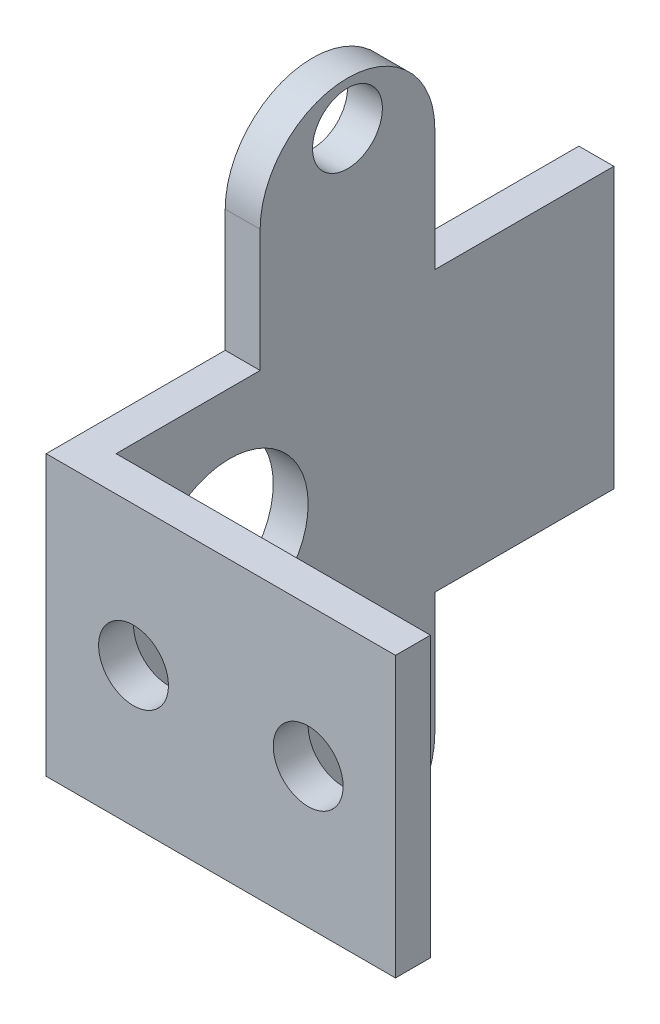
ISO-10303-21;
HEADER;
FILE_DESCRIPTION(('STEP AP214'),'2;1');
FILE_NAME('part.step','',(''),(''),'','','');
FILE_SCHEMA(('AUTOMOTIVE_DESIGN { 1 0 10303 214 1 1 1 1 }'));
ENDSEC;
DATA;
#1=APPLICATION_CONTEXT('core data for automotive mechanical design processes');
#2=APPLICATION_PROTOCOL_DEFINITION('international standard','automotive_design',2000,#1);
#3=PRODUCT_CONTEXT('',#1,'mechanical');
#4=PRODUCT('Part','Part','',(#3));
#5=PRODUCT_RELATED_PRODUCT_CATEGORY('part','',(#4));
#6=PRODUCT_DEFINITION_FORMATION('','',#4);
#7=PRODUCT_DEFINITION_CONTEXT('part definition',#1,'design');
#8=PRODUCT_DEFINITION('design','',#6,#7);
#9=PRODUCT_DEFINITION_SHAPE('','',#8);
#10=(LENGTH_UNIT() NAMED_UNIT(*) SI_UNIT(.MILLI.,.METRE.));
#11=(NAMED_UNIT(*) PLANE_ANGLE_UNIT() SI_UNIT($,.RADIAN.));
#12=(NAMED_UNIT(*) SI_UNIT($,.STERADIAN.) SOLID_ANGLE_UNIT());
#13=UNCERTAINTY_MEASURE_WITH_UNIT(LENGTH_MEASURE(1.E-05),#10,'distance_accuracy_value','');
#14=(GEOMETRIC_REPRESENTATION_CONTEXT(3) GLOBAL_UNCERTAINTY_ASSIGNED_CONTEXT((#13)) GLOBAL_UNIT_ASSIGNED_CONTEXT((#10,
#11,#12)) REPRESENTATION_CONTEXT('',''));
#15=CARTESIAN_POINT('',(0.,0.,0.));
#16=DIRECTION('',(0.,0.,1.));
#17=DIRECTION('',(1.,0.,0.));
#18=AXIS2_PLACEMENT_3D('',#15,#16,#17);
#19=CARTESIAN_POINT('',(-17.9226804123711,16.,-12.5249140893471));
#20=DIRECTION('',(1.,0.,0.));
#21=DIRECTION('',(0.,0.,-1.));
#22=AXIS2_PLACEMENT_3D('',#19,#20,#21);
#23=PLANE('',#22);
#24=CARTESIAN_POINT('',(-17.9226804123711,8.,9.47508591065292));
#25=DIRECTION('',(1.,0.,0.));
#26=DIRECTION('',(0.,0.,-1.));
#27=AXIS2_PLACEMENT_3D('',#24,#25,#26);
#28=CIRCLE('',#27,4.5);
#29=CARTESIAN_POINT('',(-17.9226804123711,8.,4.97508591065292));
#30=VERTEX_POINT('',#29);
#31=EDGE_CURVE('E339',#30,#30,#28,.T.);
#32=ORIENTED_EDGE('',*,*,#31,.T.);
#33=EDGE_LOOP('',(#32));
#34=FACE_BOUND('',#33,.T.);
#35=CARTESIAN_POINT('',(-17.9226804123711,25.5,2.72508591065292));
#36=DIRECTION('',(1.,0.,0.));
#37=DIRECTION('',(0.,0.,-1.));
#38=AXIS2_PLACEMENT_3D('',#35,#36,#37);
#39=CIRCLE('',#38,2.);
#40=CARTESIAN_POINT('',(-17.9226804123711,25.5,0.725085910652916));
#41=VERTEX_POINT('',#40);
#42=EDGE_CURVE('E154',#41,#41,#39,.F.);
#43=ORIENTED_EDGE('',*,*,#42,.F.);
#44=EDGE_LOOP('',(#43));
#45=FACE_BOUND('',#44,.T.);
#46=CARTESIAN_POINT('',(-17.9226804123711,-9.5,2.72508591065292));
#47=DIRECTION('',(1.,0.,0.));
#48=DIRECTION('',(0.,0.,-1.));
#49=AXIS2_PLACEMENT_3D('',#46,#47,#48);
#50=CIRCLE('',#49,2.);
#51=CARTESIAN_POINT('',(-17.9226804123711,-9.5,0.725085910652916));
#52=VERTEX_POINT('',#51);
#53=EDGE_CURVE('E173',#52,#52,#50,.T.);
#54=ORIENTED_EDGE('',*,*,#53,.T.);
#55=EDGE_LOOP('',(#54));
#56=FACE_BOUND('',#55,.T.);
#57=CARTESIAN_POINT('',(-17.9226804123711,23.,2.72508591065292));
#58=DIRECTION('',(1.,0.,0.));
#59=DIRECTION('',(0.,0.,-1.));
#60=AXIS2_PLACEMENT_3D('',#57,#58,#59);
#61=CIRCLE('',#60,5.);
#62=CARTESIAN_POINT('',(-17.9226804123711,23.,-2.27491408934708));
#63=VERTEX_POINT('',#62);
#64=CARTESIAN_POINT('',(-17.9226804123711,23.,7.72508591065292));
#65=VERTEX_POINT('',#64);
#66=EDGE_CURVE('E158',#63,#65,#61,.T.);
#67=ORIENTED_EDGE('',*,*,#66,.F.);
#68=DIRECTION('',(0.,-1.,0.));
#69=VECTOR('',#68,1.);
#70=CARTESIAN_POINT('',(-17.9226804123711,28.,-2.27491408934708));
#71=LINE('',#70,#69);
#72=CARTESIAN_POINT('',(-17.9226804123711,16.,-2.27491408934708));
#73=VERTEX_POINT('',#72);
#74=EDGE_CURVE('E167',#63,#73,#71,.T.);
#75=ORIENTED_EDGE('',*,*,#74,.T.);
#76=DIRECTION('',(0.,0.,1.));
#77=VECTOR('',#76,1.);
#78=CARTESIAN_POINT('',(-17.9226804123711,16.,-12.5249140893471));
#79=LINE('',#78,#77);
#80=CARTESIAN_POINT('',(-17.9226804123711,16.,-12.5249140893471));
#81=VERTEX_POINT('',#80);
#82=EDGE_CURVE('E211',#81,#73,#79,.T.);
#83=ORIENTED_EDGE('',*,*,#82,.F.);
#84=DIRECTION('',(0.,-1.,0.));
#85=VECTOR('',#84,1.);
#86=CARTESIAN_POINT('',(-17.9226804123711,16.,-12.5249140893471));
#87=LINE('',#86,#85);
#88=CARTESIAN_POINT('',(-17.9226804123711,0.,-12.5249140893471));
#89=VERTEX_POINT('',#88);
#90=EDGE_CURVE('E11',#81,#89,#87,.T.);
#91=ORIENTED_EDGE('',*,*,#90,.T.);
#92=DIRECTION('',(0.,0.,1.));
#93=VECTOR('',#92,1.);
#94=CARTESIAN_POINT('',(-17.9226804123711,0.,-12.5249140893471));
#95=LINE('',#94,#93);
#96=CARTESIAN_POINT('',(-17.9226804123711,0.,-2.27491408934708));
#97=VERTEX_POINT('',#96);
#98=EDGE_CURVE('E228',#89,#97,#95,.T.);
#99=ORIENTED_EDGE('',*,*,#98,.T.);
#100=DIRECTION('',(0.,1.,0.));
#101=VECTOR('',#100,1.);
#102=CARTESIAN_POINT('',(-17.9226804123711,-12.,-2.27491408934708));
#103=LINE('',#102,#101);
#104=CARTESIAN_POINT('',(-17.9226804123711,-7.,-2.27491408934708));
#105=VERTEX_POINT('',#104);
#106=EDGE_CURVE('E197',#105,#97,#103,.T.);
#107=ORIENTED_EDGE('',*,*,#106,.F.);
#108=CARTESIAN_POINT('',(-17.9226804123711,-7.,2.72508591065292));
#109=DIRECTION('',(1.,0.,0.));
#110=DIRECTION('',(0.,0.,-1.));
#111=AXIS2_PLACEMENT_3D('',#108,#109,#110);
#112=CIRCLE('',#111,5.);
#113=CARTESIAN_POINT('',(-17.9226804123711,-7.,7.72508591065292));
#114=VERTEX_POINT('',#113);
#115=EDGE_CURVE('E182',#105,#114,#112,.F.);
#116=ORIENTED_EDGE('',*,*,#115,.T.);
#117=DIRECTION('',(0.,1.,0.));
#118=VECTOR('',#117,1.);
#119=CARTESIAN_POINT('',(-17.9226804123711,-12.,7.72508591065292));
#120=LINE('',#119,#118);
#121=CARTESIAN_POINT('',(-17.9226804123711,0.,7.72508591065291));
#122=VERTEX_POINT('',#121);
#123=EDGE_CURVE('E191',#114,#122,#120,.T.);
#124=ORIENTED_EDGE('',*,*,#123,.T.);
#125=CARTESIAN_POINT('',(-17.9226804123711,0.,17.9750859106529));
#126=VERTEX_POINT('',#125);
#127=EDGE_CURVE('E227',#122,#126,#95,.T.);
#128=ORIENTED_EDGE('',*,*,#127,.T.);
#129=DIRECTION('',(0.,-1.,0.));
#130=VECTOR('',#129,1.);
#131=CARTESIAN_POINT('',(-17.9226804123711,16.,17.9750859106529));
#132=LINE('',#131,#130);
#133=CARTESIAN_POINT('',(-17.9226804123711,16.,17.9750859106529));
#134=VERTEX_POINT('',#133);
#135=EDGE_CURVE('E52',#134,#126,#132,.T.);
#136=ORIENTED_EDGE('',*,*,#135,.F.);
#137=CARTESIAN_POINT('',(-17.9226804123711,16.,7.72508591065291));
#138=VERTEX_POINT('',#137);
#139=EDGE_CURVE('E209',#138,#134,#79,.T.);
#140=ORIENTED_EDGE('',*,*,#139,.F.);
#141=DIRECTION('',(0.,-1.,0.));
#142=VECTOR('',#141,1.);
#143=CARTESIAN_POINT('',(-17.9226804123711,28.,7.72508591065292));
#144=LINE('',#143,#142);
#145=EDGE_CURVE('E68',#65,#138,#144,.T.);
#146=ORIENTED_EDGE('',*,*,#145,.F.);
#147=EDGE_LOOP('',(#67,#75,#83,#91,#99,#107,#116,#124,#128,#136,#140,#146));
#148=FACE_BOUND('',#147,.T.);
#149=ADVANCED_FACE('F43',(#34,#45,#56,#148),#23,.F.);
#150=CARTESIAN_POINT('',(-15.9226804123711,16.,-12.5249140893471));
#151=DIRECTION('',(-1.,0.,0.));
#152=DIRECTION('',(0.,0.,1.));
#153=AXIS2_PLACEMENT_3D('',#150,#151,#152);
#154=PLANE('',#153);
#155=CARTESIAN_POINT('',(-15.9226804123711,8.,9.47508591065292));
#156=DIRECTION('',(1.,0.,0.));
#157=DIRECTION('',(0.,0.,-1.));
#158=AXIS2_PLACEMENT_3D('',#155,#156,#157);
#159=CIRCLE('',#158,4.5);
#160=CARTESIAN_POINT('',(-15.9226804123711,8.,4.97508591065292));
#161=VERTEX_POINT('',#160);
#162=EDGE_CURVE('E341',#161,#161,#159,.T.);
#163=ORIENTED_EDGE('',*,*,#162,.F.);
#164=EDGE_LOOP('',(#163));
#165=FACE_BOUND('',#164,.T.);
#166=CARTESIAN_POINT('',(-15.9226804123711,25.5,2.72508591065292));
#167=DIRECTION('',(-1.,0.,0.));
#168=DIRECTION('',(0.,0.,-1.));
#169=AXIS2_PLACEMENT_3D('',#166,#167,#168);
#170=CIRCLE('',#169,2.);
#171=CARTESIAN_POINT('',(-15.9226804123711,25.5,0.725085910652916));
#172=VERTEX_POINT('',#171);
#173=EDGE_CURVE('E336',#172,#172,#170,.T.);
#174=ORIENTED_EDGE('',*,*,#173,.T.);
#175=EDGE_LOOP('',(#174));
#176=FACE_BOUND('',#175,.T.);
#177=CARTESIAN_POINT('',(-15.9226804123711,-9.5,2.72508591065292));
#178=DIRECTION('',(1.,0.,0.));
#179=DIRECTION('',(0.,0.,-1.));
#180=AXIS2_PLACEMENT_3D('',#177,#178,#179);
#181=CIRCLE('',#180,2.);
#182=CARTESIAN_POINT('',(-15.9226804123711,-9.5,0.725085910652916));
#183=VERTEX_POINT('',#182);
#184=EDGE_CURVE('E165',#183,#183,#181,.T.);
#185=ORIENTED_EDGE('',*,*,#184,.F.);
#186=EDGE_LOOP('',(#185));
#187=FACE_BOUND('',#186,.T.);
#188=CARTESIAN_POINT('',(-15.9226804123711,23.,2.72508591065292));
#189=DIRECTION('',(1.,0.,0.));
#190=DIRECTION('',(0.,0.,-1.));
#191=AXIS2_PLACEMENT_3D('',#188,#189,#190);
#192=CIRCLE('',#191,5.);
#193=CARTESIAN_POINT('',(-15.9226804123711,23.,-2.27491408934708));
#194=VERTEX_POINT('',#193);
#195=CARTESIAN_POINT('',(-15.9226804123711,23.,7.72508591065292));
#196=VERTEX_POINT('',#195);
#197=EDGE_CURVE('E60',#194,#196,#192,.T.);
#198=ORIENTED_EDGE('',*,*,#197,.T.);
#199=DIRECTION('',(0.,-1.,0.));
#200=VECTOR('',#199,1.);
#201=CARTESIAN_POINT('',(-15.9226804123711,28.,7.72508591065292));
#202=LINE('',#201,#200);
#203=CARTESIAN_POINT('',(-15.9226804123711,16.,7.72508591065292));
#204=VERTEX_POINT('',#203);
#205=EDGE_CURVE('E150',#196,#204,#202,.T.);
#206=ORIENTED_EDGE('',*,*,#205,.T.);
#207=DIRECTION('',(0.,0.,-1.));
#208=VECTOR('',#207,1.);
#209=CARTESIAN_POINT('',(-15.9226804123711,16.,-12.5249140893471));
#210=LINE('',#209,#208);
#211=CARTESIAN_POINT('',(-15.9226804123711,16.,15.9750859106529));
#212=VERTEX_POINT('',#211);
#213=EDGE_CURVE('E221',#212,#204,#210,.T.);
#214=ORIENTED_EDGE('',*,*,#213,.F.);
#215=DIRECTION('',(0.,-1.,0.));
#216=VECTOR('',#215,1.);
#217=CARTESIAN_POINT('',(-15.9226804123711,16.,15.9750859106529));
#218=LINE('',#217,#216);
#219=CARTESIAN_POINT('',(-15.9226804123711,0.,15.9750859106529));
#220=VERTEX_POINT('',#219);
#221=EDGE_CURVE('E242',#212,#220,#218,.T.);
#222=ORIENTED_EDGE('',*,*,#221,.T.);
#223=DIRECTION('',(0.,0.,-1.));
#224=VECTOR('',#223,1.);
#225=CARTESIAN_POINT('',(-15.9226804123711,0.,-12.5249140893471));
#226=LINE('',#225,#224);
#227=CARTESIAN_POINT('',(-15.9226804123711,0.,7.72508591065292));
#228=VERTEX_POINT('',#227);
#229=EDGE_CURVE('E210',#220,#228,#226,.T.);
#230=ORIENTED_EDGE('',*,*,#229,.T.);
#231=DIRECTION('',(0.,1.,0.));
#232=VECTOR('',#231,1.);
#233=CARTESIAN_POINT('',(-15.9226804123711,-12.,7.72508591065292));
#234=LINE('',#233,#232);
#235=CARTESIAN_POINT('',(-15.9226804123711,-7.,7.72508591065292));
#236=VERTEX_POINT('',#235);
#237=EDGE_CURVE('E193',#236,#228,#234,.T.);
#238=ORIENTED_EDGE('',*,*,#237,.F.);
#239=CARTESIAN_POINT('',(-15.9226804123711,-7.,2.72508591065292));
#240=DIRECTION('',(-1.,0.,0.));
#241=DIRECTION('',(0.,0.,-1.));
#242=AXIS2_PLACEMENT_3D('',#239,#240,#241);
#243=CIRCLE('',#242,5.);
#244=CARTESIAN_POINT('',(-15.9226804123711,-7.,-2.27491408934708));
#245=VERTEX_POINT('',#244);
#246=EDGE_CURVE('E176',#245,#236,#243,.T.);
#247=ORIENTED_EDGE('',*,*,#246,.F.);
#248=DIRECTION('',(0.,1.,0.));
#249=VECTOR('',#248,1.);
#250=CARTESIAN_POINT('',(-15.9226804123711,-12.,-2.27491408934708));
#251=LINE('',#250,#249);
#252=CARTESIAN_POINT('',(-15.9226804123711,0.,-2.27491408934708));
#253=VERTEX_POINT('',#252);
#254=EDGE_CURVE('E195',#245,#253,#251,.T.);
#255=ORIENTED_EDGE('',*,*,#254,.T.);
#256=CARTESIAN_POINT('',(-15.9226804123711,0.,-12.5249140893471));
#257=VERTEX_POINT('',#256);
#258=EDGE_CURVE('E237',#253,#257,#226,.T.);
#259=ORIENTED_EDGE('',*,*,#258,.T.);
#260=DIRECTION('',(0.,-1.,0.));
#261=VECTOR('',#260,1.);
#262=CARTESIAN_POINT('',(-15.9226804123711,16.,-12.5249140893471));
#263=LINE('',#262,#261);
#264=CARTESIAN_POINT('',(-15.9226804123711,16.,-12.5249140893471));
#265=VERTEX_POINT('',#264);
#266=EDGE_CURVE('E223',#265,#257,#263,.T.);
#267=ORIENTED_EDGE('',*,*,#266,.F.);
#268=CARTESIAN_POINT('',(-15.9226804123711,16.,-2.27491408934708));
#269=VERTEX_POINT('',#268);
#270=EDGE_CURVE('E220',#269,#265,#210,.T.);
#271=ORIENTED_EDGE('',*,*,#270,.F.);
#272=DIRECTION('',(0.,-1.,0.));
#273=VECTOR('',#272,1.);
#274=CARTESIAN_POINT('',(-15.9226804123711,28.,-2.27491408934708));
#275=LINE('',#274,#273);
#276=EDGE_CURVE('E152',#194,#269,#275,.T.);
#277=ORIENTED_EDGE('',*,*,#276,.F.);
#278=EDGE_LOOP('',(#198,#206,#214,#222,#230,#238,#247,#255,#259,#267,#271,#277));
#279=FACE_BOUND('',#278,.T.);
#280=ADVANCED_FACE('F147',(#165,#176,#187,#279),#154,.F.);
#281=CARTESIAN_POINT('',(-17.9226804123711,28.,-2.27491408934708));
#282=DIRECTION('',(0.,0.,-1.));
#283=DIRECTION('',(-1.,0.,0.));
#284=AXIS2_PLACEMENT_3D('',#281,#282,#283);
#285=PLANE('',#284);
#286=ORIENTED_EDGE('',*,*,#74,.F.);
#287=DIRECTION('',(1.,0.,0.));
#288=VECTOR('',#287,1.);
#289=CARTESIAN_POINT('',(-27.9226804123711,23.,-2.27491408934708));
#290=LINE('',#289,#288);
#291=EDGE_CURVE('E159',#63,#194,#290,.T.);
#292=ORIENTED_EDGE('',*,*,#291,.T.);
#293=ORIENTED_EDGE('',*,*,#276,.T.);
#294=DIRECTION('',(1.,0.,0.));
#295=VECTOR('',#294,1.);
#296=CARTESIAN_POINT('',(-17.9226804123711,16.,-2.27491408934708));
#297=LINE('',#296,#295);
#298=EDGE_CURVE('E324',#73,#269,#297,.T.);
#299=ORIENTED_EDGE('',*,*,#298,.F.);
#300=EDGE_LOOP('',(#286,#292,#293,#299));
#301=FACE_BOUND('',#300,.T.);
#302=ADVANCED_FACE('F283',(#301),#285,.T.);
#303=CARTESIAN_POINT('',(0.,16.,0.));
#304=DIRECTION('',(0.,-1.,0.));
#305=DIRECTION('',(0.,0.,-1.));
#306=AXIS2_PLACEMENT_3D('',#303,#304,#305);
#307=PLANE('',#306);
#308=ORIENTED_EDGE('',*,*,#82,.T.);
#309=ORIENTED_EDGE('',*,*,#298,.T.);
#310=ORIENTED_EDGE('',*,*,#270,.T.);
#311=DIRECTION('',(-1.,0.,0.));
#312=VECTOR('',#311,1.);
#313=CARTESIAN_POINT('',(-17.9226804123711,16.,-12.5249140893471));
#314=LINE('',#313,#312);
#315=EDGE_CURVE('E206',#265,#81,#314,.T.);
#316=ORIENTED_EDGE('',*,*,#315,.T.);
#317=EDGE_LOOP('',(#308,#309,#310,#316));
#318=FACE_BOUND('',#317,.T.);
#319=ADVANCED_FACE('F306',(#318),#307,.F.);
#320=CARTESIAN_POINT('',(-17.9226804123711,-12.,7.72508591065292));
#321=DIRECTION('',(0.,0.,-1.));
#322=DIRECTION('',(-1.,0.,0.));
#323=AXIS2_PLACEMENT_3D('',#320,#321,#322);
#324=PLANE('',#323);
#325=DIRECTION('',(1.,0.,0.));
#326=VECTOR('',#325,1.);
#327=CARTESIAN_POINT('',(-27.9226804123711,-7.,7.72508591065292));
#328=LINE('',#327,#326);
#329=EDGE_CURVE('E179',#114,#236,#328,.T.);
#330=ORIENTED_EDGE('',*,*,#329,.T.);
#331=ORIENTED_EDGE('',*,*,#237,.T.);
#332=DIRECTION('',(-1.,0.,0.));
#333=VECTOR('',#332,1.);
#334=CARTESIAN_POINT('',(-17.9226804123711,0.,7.72508591065292));
#335=LINE('',#334,#333);
#336=EDGE_CURVE('E188',#228,#122,#335,.T.);
#337=ORIENTED_EDGE('',*,*,#336,.T.);
#338=ORIENTED_EDGE('',*,*,#123,.F.);
#339=EDGE_LOOP('',(#330,#331,#337,#338));
#340=FACE_BOUND('',#339,.T.);
#341=ADVANCED_FACE('F311',(#340),#324,.F.);
#342=CARTESIAN_POINT('',(0.,0.,0.));
#343=DIRECTION('',(0.,-1.,0.));
#344=DIRECTION('',(0.,0.,-1.));
#345=AXIS2_PLACEMENT_3D('',#342,#343,#344);
#346=PLANE('',#345);
#347=ORIENTED_EDGE('',*,*,#336,.F.);
#348=ORIENTED_EDGE('',*,*,#229,.F.);
#349=DIRECTION('',(-1.,0.,0.));
#350=VECTOR('',#349,1.);
#351=CARTESIAN_POINT('',(-15.9226804123711,0.,15.9750859106529));
#352=LINE('',#351,#350);
#353=CARTESIAN_POINT('',(2.07731958762886,0.,15.9750859106529));
#354=VERTEX_POINT('',#353);
#355=EDGE_CURVE('E235',#354,#220,#352,.T.);
#356=ORIENTED_EDGE('',*,*,#355,.F.);
#357=DIRECTION('',(0.,0.,-1.));
#358=VECTOR('',#357,1.);
#359=CARTESIAN_POINT('',(2.07731958762886,0.,15.9750859106529));
#360=LINE('',#359,#358);
#361=CARTESIAN_POINT('',(2.07731958762886,0.,17.9750859106529));
#362=VERTEX_POINT('',#361);
#363=EDGE_CURVE('E233',#362,#354,#360,.T.);
#364=ORIENTED_EDGE('',*,*,#363,.F.);
#365=DIRECTION('',(1.,0.,0.));
#366=VECTOR('',#365,1.);
#367=CARTESIAN_POINT('',(-17.9226804123711,0.,17.9750859106529));
#368=LINE('',#367,#366);
#369=EDGE_CURVE('E231',#126,#362,#368,.T.);
#370=ORIENTED_EDGE('',*,*,#369,.F.);
#371=ORIENTED_EDGE('',*,*,#127,.F.);
#372=EDGE_LOOP('',(#347,#348,#356,#364,#370,#371));
#373=FACE_BOUND('',#372,.T.);
#374=ADVANCED_FACE('F303',(#373),#346,.T.);
#375=CARTESIAN_POINT('',(-17.9226804123711,16.,-12.5249140893471));
#376=DIRECTION('',(0.,0.,1.));
#377=DIRECTION('',(1.,0.,0.));
#378=AXIS2_PLACEMENT_3D('',#375,#376,#377);
#379=PLANE('',#378);
#380=DIRECTION('',(-1.,0.,0.));
#381=VECTOR('',#380,1.);
#382=CARTESIAN_POINT('',(-17.9226804123711,0.,-12.5249140893471));
#383=LINE('',#382,#381);
#384=EDGE_CURVE('E224',#257,#89,#383,.T.);
#385=ORIENTED_EDGE('',*,*,#384,.T.);
#386=ORIENTED_EDGE('',*,*,#90,.F.);
#387=ORIENTED_EDGE('',*,*,#315,.F.);
#388=ORIENTED_EDGE('',*,*,#266,.T.);
#389=EDGE_LOOP('',(#385,#386,#387,#388));
#390=FACE_BOUND('',#389,.T.);
#391=ADVANCED_FACE('F45',(#390),#379,.F.);
#392=CARTESIAN_POINT('',(-17.9226804123711,16.,17.9750859106529));
#393=DIRECTION('',(0.,0.,-1.));
#394=DIRECTION('',(-1.,0.,0.));
#395=AXIS2_PLACEMENT_3D('',#392,#393,#394);
#396=PLANE('',#395);
#397=CARTESIAN_POINT('',(-12.9226804123711,8.,17.9750859106529));
#398=DIRECTION('',(0.,0.,1.));
#399=DIRECTION('',(1.,0.,0.));
#400=AXIS2_PLACEMENT_3D('',#397,#398,#399);
#401=CIRCLE('',#400,2.);
#402=CARTESIAN_POINT('',(-10.9226804123711,8.,17.9750859106529));
#403=VERTEX_POINT('',#402);
#404=EDGE_CURVE('E200',#403,#403,#401,.T.);
#405=ORIENTED_EDGE('',*,*,#404,.F.);
#406=EDGE_LOOP('',(#405));
#407=FACE_BOUND('',#406,.T.);
#408=CARTESIAN_POINT('',(-2.92268041237114,8.,17.9750859106529));
#409=DIRECTION('',(0.,0.,1.));
#410=DIRECTION('',(1.,0.,0.));
#411=AXIS2_PLACEMENT_3D('',#408,#409,#410);
#412=CIRCLE('',#411,2.);
#413=CARTESIAN_POINT('',(-0.922680412371144,8.,17.9750859106529));
#414=VERTEX_POINT('',#413);
#415=EDGE_CURVE('E199',#414,#414,#412,.T.);
#416=ORIENTED_EDGE('',*,*,#415,.F.);
#417=EDGE_LOOP('',(#416));
#418=FACE_BOUND('',#417,.T.);
#419=ORIENTED_EDGE('',*,*,#369,.T.);
#420=DIRECTION('',(0.,-1.,0.));
#421=VECTOR('',#420,1.);
#422=CARTESIAN_POINT('',(2.07731958762886,16.,17.9750859106529));
#423=LINE('',#422,#421);
#424=CARTESIAN_POINT('',(2.07731958762886,16.,17.9750859106529));
#425=VERTEX_POINT('',#424);
#426=EDGE_CURVE('E248',#425,#362,#423,.T.);
#427=ORIENTED_EDGE('',*,*,#426,.F.);
#428=DIRECTION('',(1.,0.,0.));
#429=VECTOR('',#428,1.);
#430=CARTESIAN_POINT('',(-17.9226804123711,16.,17.9750859106529));
#431=LINE('',#430,#429);
#432=EDGE_CURVE('E214',#134,#425,#431,.T.);
#433=ORIENTED_EDGE('',*,*,#432,.F.);
#434=ORIENTED_EDGE('',*,*,#135,.T.);
#435=EDGE_LOOP('',(#419,#427,#433,#434));
#436=FACE_BOUND('',#435,.T.);
#437=ADVANCED_FACE('F289',(#407,#418,#436),#396,.F.);
#438=CARTESIAN_POINT('',(2.07731958762886,16.,15.9750859106529));
#439=DIRECTION('',(-1.,0.,0.));
#440=DIRECTION('',(0.,0.,1.));
#441=AXIS2_PLACEMENT_3D('',#438,#439,#440);
#442=PLANE('',#441);
#443=ORIENTED_EDGE('',*,*,#363,.T.);
#444=DIRECTION('',(0.,-1.,0.));
#445=VECTOR('',#444,1.);
#446=CARTESIAN_POINT('',(2.07731958762886,16.,15.9750859106529));
#447=LINE('',#446,#445);
#448=CARTESIAN_POINT('',(2.07731958762886,16.,15.9750859106529));
#449=VERTEX_POINT('',#448);
#450=EDGE_CURVE('E245',#449,#354,#447,.T.);
#451=ORIENTED_EDGE('',*,*,#450,.F.);
#452=DIRECTION('',(0.,0.,-1.));
#453=VECTOR('',#452,1.);
#454=CARTESIAN_POINT('',(2.07731958762886,16.,15.9750859106529));
#455=LINE('',#454,#453);
#456=EDGE_CURVE('E216',#425,#449,#455,.T.);
#457=ORIENTED_EDGE('',*,*,#456,.F.);
#458=ORIENTED_EDGE('',*,*,#426,.T.);
#459=EDGE_LOOP('',(#443,#451,#457,#458));
#460=FACE_BOUND('',#459,.T.);
#461=ADVANCED_FACE('F292',(#460),#442,.F.);
#462=CARTESIAN_POINT('',(-15.9226804123711,16.,15.9750859106529));
#463=DIRECTION('',(0.,0.,1.));
#464=DIRECTION('',(1.,0.,0.));
#465=AXIS2_PLACEMENT_3D('',#462,#463,#464);
#466=PLANE('',#465);
#467=CARTESIAN_POINT('',(-12.9226804123711,8.,15.9750859106529));
#468=DIRECTION('',(0.,0.,1.));
#469=DIRECTION('',(1.,0.,0.));
#470=AXIS2_PLACEMENT_3D('',#467,#468,#469);
#471=CIRCLE('',#470,2.);
#472=CARTESIAN_POINT('',(-10.9226804123711,8.,15.9750859106529));
#473=VERTEX_POINT('',#472);
#474=EDGE_CURVE('E47',#473,#473,#471,.T.);
#475=ORIENTED_EDGE('',*,*,#474,.T.);
#476=EDGE_LOOP('',(#475));
#477=FACE_BOUND('',#476,.T.);
#478=CARTESIAN_POINT('',(-2.92268041237114,8.,15.9750859106529));
#479=DIRECTION('',(0.,0.,1.));
#480=DIRECTION('',(1.,0.,0.));
#481=AXIS2_PLACEMENT_3D('',#478,#479,#480);
#482=CIRCLE('',#481,2.);
#483=CARTESIAN_POINT('',(-0.922680412371144,8.,15.9750859106529));
#484=VERTEX_POINT('',#483);
#485=EDGE_CURVE('E203',#484,#484,#482,.T.);
#486=ORIENTED_EDGE('',*,*,#485,.T.);
#487=EDGE_LOOP('',(#486));
#488=FACE_BOUND('',#487,.T.);
#489=ORIENTED_EDGE('',*,*,#355,.T.);
#490=ORIENTED_EDGE('',*,*,#221,.F.);
#491=DIRECTION('',(-1.,0.,0.));
#492=VECTOR('',#491,1.);
#493=CARTESIAN_POINT('',(-15.9226804123711,16.,15.9750859106529));
#494=LINE('',#493,#492);
#495=EDGE_CURVE('E218',#449,#212,#494,.T.);
#496=ORIENTED_EDGE('',*,*,#495,.F.);
#497=ORIENTED_EDGE('',*,*,#450,.T.);
#498=EDGE_LOOP('',(#489,#490,#496,#497));
#499=FACE_BOUND('',#498,.T.);
#500=ADVANCED_FACE('F258',(#477,#488,#499),#466,.F.);
#501=ORIENTED_EDGE('',*,*,#213,.T.);
#502=DIRECTION('',(-1.,0.,0.));
#503=VECTOR('',#502,1.);
#504=CARTESIAN_POINT('',(-17.9226804123711,16.,7.72508591065292));
#505=LINE('',#504,#503);
#506=EDGE_CURVE('E162',#204,#138,#505,.T.);
#507=ORIENTED_EDGE('',*,*,#506,.T.);
#508=ORIENTED_EDGE('',*,*,#139,.T.);
#509=ORIENTED_EDGE('',*,*,#432,.T.);
#510=ORIENTED_EDGE('',*,*,#456,.T.);
#511=ORIENTED_EDGE('',*,*,#495,.T.);
#512=EDGE_LOOP('',(#501,#507,#508,#509,#510,#511));
#513=FACE_BOUND('',#512,.T.);
#514=ADVANCED_FACE('F298',(#513),#307,.F.);
#515=DIRECTION('',(1.,0.,0.));
#516=VECTOR('',#515,1.);
#517=CARTESIAN_POINT('',(-17.9226804123711,0.,-2.27491408934708));
#518=LINE('',#517,#516);
#519=EDGE_CURVE('E185',#97,#253,#518,.T.);
#520=ORIENTED_EDGE('',*,*,#519,.F.);
#521=ORIENTED_EDGE('',*,*,#98,.F.);
#522=ORIENTED_EDGE('',*,*,#384,.F.);
#523=ORIENTED_EDGE('',*,*,#258,.F.);
#524=EDGE_LOOP('',(#520,#521,#522,#523));
#525=FACE_BOUND('',#524,.T.);
#526=ADVANCED_FACE('F274',(#525),#346,.T.);
#527=CARTESIAN_POINT('',(-2.92268041237114,8.,1.97508591065292));
#528=DIRECTION('',(0.,0.,1.));
#529=DIRECTION('',(1.,0.,0.));
#530=AXIS2_PLACEMENT_3D('',#527,#528,#529);
#531=CYLINDRICAL_SURFACE('',#530,2.);
#532=ORIENTED_EDGE('',*,*,#415,.T.);
#533=EDGE_LOOP('',(#532));
#534=FACE_BOUND('',#533,.T.);
#535=ORIENTED_EDGE('',*,*,#485,.F.);
#536=EDGE_LOOP('',(#535));
#537=FACE_BOUND('',#536,.T.);
#538=ADVANCED_FACE('F263',(#534,#537),#531,.F.);
#539=CARTESIAN_POINT('',(-12.9226804123711,8.,1.97508591065292));
#540=DIRECTION('',(0.,0.,1.));
#541=DIRECTION('',(1.,0.,0.));
#542=AXIS2_PLACEMENT_3D('',#539,#540,#541);
#543=CYLINDRICAL_SURFACE('',#542,2.);
#544=ORIENTED_EDGE('',*,*,#404,.T.);
#545=EDGE_LOOP('',(#544));
#546=FACE_BOUND('',#545,.T.);
#547=ORIENTED_EDGE('',*,*,#474,.F.);
#548=EDGE_LOOP('',(#547));
#549=FACE_BOUND('',#548,.T.);
#550=ADVANCED_FACE('F260',(#546,#549),#543,.F.);
#551=CARTESIAN_POINT('',(-17.9226804123711,-12.,-2.27491408934708));
#552=DIRECTION('',(0.,0.,1.));
#553=DIRECTION('',(1.,0.,0.));
#554=AXIS2_PLACEMENT_3D('',#551,#552,#553);
#555=PLANE('',#554);
#556=ORIENTED_EDGE('',*,*,#254,.F.);
#557=DIRECTION('',(1.,0.,0.));
#558=VECTOR('',#557,1.);
#559=CARTESIAN_POINT('',(-27.9226804123711,-7.,-2.27491408934708));
#560=LINE('',#559,#558);
#561=EDGE_CURVE('E178',#105,#245,#560,.T.);
#562=ORIENTED_EDGE('',*,*,#561,.F.);
#563=ORIENTED_EDGE('',*,*,#106,.T.);
#564=ORIENTED_EDGE('',*,*,#519,.T.);
#565=EDGE_LOOP('',(#556,#562,#563,#564));
#566=FACE_BOUND('',#565,.T.);
#567=ADVANCED_FACE('F262',(#566),#555,.F.);
#568=CARTESIAN_POINT('',(-27.9226804123711,-7.,2.72508591065292));
#569=DIRECTION('',(1.,0.,0.));
#570=DIRECTION('',(0.,0.,-1.));
#571=AXIS2_PLACEMENT_3D('',#568,#569,#570);
#572=CYLINDRICAL_SURFACE('',#571,5.);
#573=ORIENTED_EDGE('',*,*,#561,.T.);
#574=ORIENTED_EDGE('',*,*,#246,.T.);
#575=ORIENTED_EDGE('',*,*,#329,.F.);
#576=ORIENTED_EDGE('',*,*,#115,.F.);
#577=EDGE_LOOP('',(#573,#574,#575,#576));
#578=FACE_BOUND('',#577,.T.);
#579=ADVANCED_FACE('F271',(#578),#572,.T.);
#580=CARTESIAN_POINT('',(-27.9226804123711,-9.5,2.72508591065292));
#581=DIRECTION('',(1.,0.,0.));
#582=DIRECTION('',(0.,0.,-1.));
#583=AXIS2_PLACEMENT_3D('',#580,#581,#582);
#584=CYLINDRICAL_SURFACE('',#583,2.);
#585=ORIENTED_EDGE('',*,*,#184,.T.);
#586=EDGE_LOOP('',(#585));
#587=FACE_BOUND('',#586,.T.);
#588=ORIENTED_EDGE('',*,*,#53,.F.);
#589=EDGE_LOOP('',(#588));
#590=FACE_BOUND('',#589,.T.);
#591=ADVANCED_FACE('F352',(#587,#590),#584,.F.);
#592=CARTESIAN_POINT('',(-17.9226804123711,28.,7.72508591065292));
#593=DIRECTION('',(0.,0.,1.));
#594=DIRECTION('',(1.,0.,0.));
#595=AXIS2_PLACEMENT_3D('',#592,#593,#594);
#596=PLANE('',#595);
#597=DIRECTION('',(1.,0.,0.));
#598=VECTOR('',#597,1.);
#599=CARTESIAN_POINT('',(-27.9226804123711,23.,7.72508591065292));
#600=LINE('',#599,#598);
#601=EDGE_CURVE('E153',#65,#196,#600,.T.);
#602=ORIENTED_EDGE('',*,*,#601,.F.);
#603=ORIENTED_EDGE('',*,*,#145,.T.);
#604=ORIENTED_EDGE('',*,*,#506,.F.);
#605=ORIENTED_EDGE('',*,*,#205,.F.);
#606=EDGE_LOOP('',(#602,#603,#604,#605));
#607=FACE_BOUND('',#606,.T.);
#608=ADVANCED_FACE('F161',(#607),#596,.T.);
#609=CARTESIAN_POINT('',(-27.9226804123711,23.,2.72508591065292));
#610=DIRECTION('',(1.,0.,0.));
#611=DIRECTION('',(0.,0.,-1.));
#612=AXIS2_PLACEMENT_3D('',#609,#610,#611);
#613=CYLINDRICAL_SURFACE('',#612,5.);
#614=ORIENTED_EDGE('',*,*,#66,.T.);
#615=ORIENTED_EDGE('',*,*,#601,.T.);
#616=ORIENTED_EDGE('',*,*,#197,.F.);
#617=ORIENTED_EDGE('',*,*,#291,.F.);
#618=EDGE_LOOP('',(#614,#615,#616,#617));
#619=FACE_BOUND('',#618,.T.);
#620=ADVANCED_FACE('F156',(#619),#613,.T.);
#621=CARTESIAN_POINT('',(-27.9226804123711,25.5,2.72508591065292));
#622=DIRECTION('',(1.,0.,0.));
#623=DIRECTION('',(0.,0.,-1.));
#624=AXIS2_PLACEMENT_3D('',#621,#622,#623);
#625=CYLINDRICAL_SURFACE('',#624,2.);
#626=ORIENTED_EDGE('',*,*,#173,.F.);
#627=EDGE_LOOP('',(#626));
#628=FACE_BOUND('',#627,.T.);
#629=ORIENTED_EDGE('',*,*,#42,.T.);
#630=EDGE_LOOP('',(#629));
#631=FACE_BOUND('',#630,.T.);
#632=ADVANCED_FACE('F368',(#628,#631),#625,.F.);
#633=CARTESIAN_POINT('',(-27.9226804123711,8.,9.47508591065292));
#634=DIRECTION('',(1.,0.,0.));
#635=DIRECTION('',(0.,0.,-1.));
#636=AXIS2_PLACEMENT_3D('',#633,#634,#635);
#637=CYLINDRICAL_SURFACE('',#636,4.5);
#638=ORIENTED_EDGE('',*,*,#162,.T.);
#639=EDGE_LOOP('',(#638));
#640=FACE_BOUND('',#639,.T.);
#641=ORIENTED_EDGE('',*,*,#31,.F.);
#642=EDGE_LOOP('',(#641));
#643=FACE_BOUND('',#642,.T.);
#644=ADVANCED_FACE('F345',(#640,#643),#637,.F.);
#645=CLOSED_SHELL('',(#149,#280,#302,#319,#341,#374,#391,#437,#461,#500,#514,#526,#538,#550,
#567,#579,#591,#608,#620,#632,#644));
#646=MANIFOLD_SOLID_BREP('B2',#645);
#647=ADVANCED_BREP_SHAPE_REPRESENTATION('',(#18,#646),#14);
#648=SHAPE_DEFINITION_REPRESENTATION(#9,#647);
ENDSEC;
END-ISO-10303-21;
